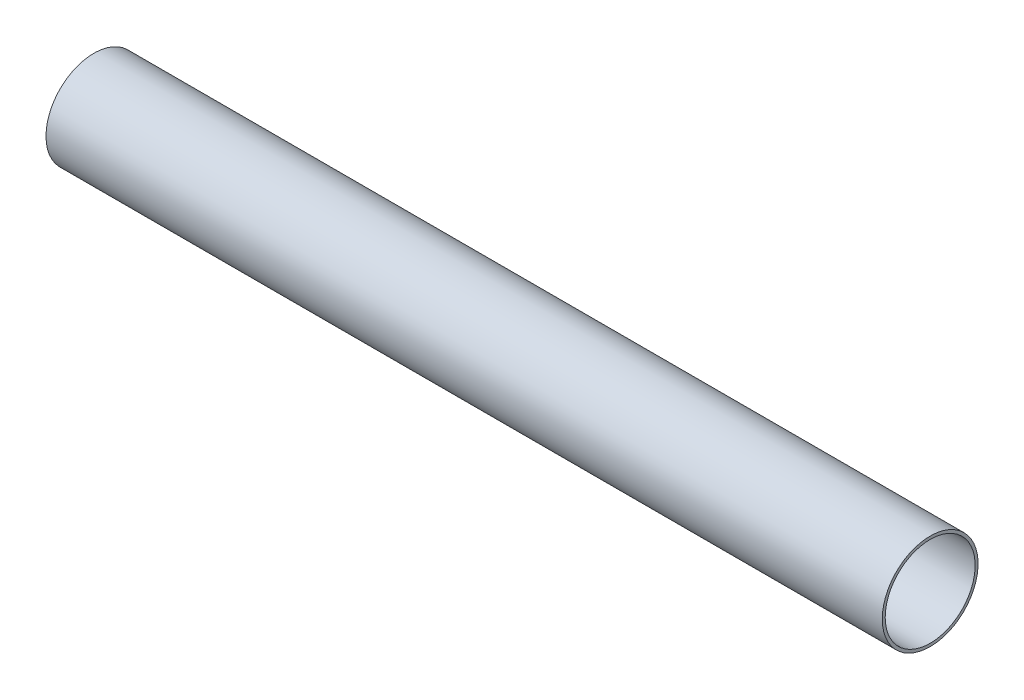
ISO-10303-21;
HEADER;
FILE_DESCRIPTION(('STEP AP214'),'2;1');
FILE_NAME('part.step','',(''),(''),'','','');
FILE_SCHEMA(('AUTOMOTIVE_DESIGN { 1 0 10303 214 1 1 1 1 }'));
ENDSEC;
DATA;
#1=APPLICATION_CONTEXT('core data for automotive mechanical design processes');
#2=APPLICATION_PROTOCOL_DEFINITION('international standard','automotive_design',2000,#1);
#3=PRODUCT_CONTEXT('',#1,'mechanical');
#4=PRODUCT('Part','Part','',(#3));
#5=PRODUCT_RELATED_PRODUCT_CATEGORY('part','',(#4));
#6=PRODUCT_DEFINITION_FORMATION('','',#4);
#7=PRODUCT_DEFINITION_CONTEXT('part definition',#1,'design');
#8=PRODUCT_DEFINITION('design','',#6,#7);
#9=PRODUCT_DEFINITION_SHAPE('','',#8);
#10=(LENGTH_UNIT() NAMED_UNIT(*) SI_UNIT(.MILLI.,.METRE.));
#11=(NAMED_UNIT(*) PLANE_ANGLE_UNIT() SI_UNIT($,.RADIAN.));
#12=(NAMED_UNIT(*) SI_UNIT($,.STERADIAN.) SOLID_ANGLE_UNIT());
#13=UNCERTAINTY_MEASURE_WITH_UNIT(LENGTH_MEASURE(1.E-05),#10,'distance_accuracy_value','');
#14=(GEOMETRIC_REPRESENTATION_CONTEXT(3) GLOBAL_UNCERTAINTY_ASSIGNED_CONTEXT((#13)) GLOBAL_UNIT_ASSIGNED_CONTEXT((#10,
#11,#12)) REPRESENTATION_CONTEXT('',''));
#15=CARTESIAN_POINT('',(0.,0.,0.));
#16=DIRECTION('',(0.,0.,1.));
#17=DIRECTION('',(1.,0.,0.));
#18=AXIS2_PLACEMENT_3D('',#15,#16,#17);
#19=CARTESIAN_POINT('',(152.4,0.,0.));
#20=DIRECTION('',(1.,0.,0.));
#21=DIRECTION('',(0.,0.,-1.));
#22=AXIS2_PLACEMENT_3D('',#19,#20,#21);
#23=PLANE('',#22);
#24=CARTESIAN_POINT('',(152.4,0.,0.));
#25=DIRECTION('',(1.,0.,0.));
#26=DIRECTION('',(0.,0.,-1.));
#27=AXIS2_PLACEMENT_3D('',#24,#25,#26);
#28=CIRCLE('',#27,17.4625);
#29=CARTESIAN_POINT('',(152.4,0.,17.4625));
#30=VERTEX_POINT('',#29);
#31=EDGE_CURVE('E10',#30,#30,#28,.T.);
#32=ORIENTED_EDGE('',*,*,#31,.T.);
#33=EDGE_LOOP('',(#32));
#34=FACE_BOUND('',#33,.T.);
#35=CARTESIAN_POINT('',(152.4,0.,0.));
#36=DIRECTION('',(1.,0.,0.));
#37=DIRECTION('',(0.,0.,-1.));
#38=AXIS2_PLACEMENT_3D('',#35,#36,#37);
#39=CIRCLE('',#38,16.3957);
#40=CARTESIAN_POINT('',(152.4,0.,16.3957));
#41=VERTEX_POINT('',#40);
#42=EDGE_CURVE('E43',#41,#41,#39,.T.);
#43=ORIENTED_EDGE('',*,*,#42,.F.);
#44=EDGE_LOOP('',(#43));
#45=FACE_BOUND('',#44,.T.);
#46=ADVANCED_FACE('F32',(#34,#45),#23,.T.);
#47=CARTESIAN_POINT('',(-152.4,0.,0.));
#48=DIRECTION('',(1.,0.,0.));
#49=DIRECTION('',(0.,0.,-1.));
#50=AXIS2_PLACEMENT_3D('',#47,#48,#49);
#51=PLANE('',#50);
#52=CARTESIAN_POINT('',(-152.4,0.,0.));
#53=DIRECTION('',(1.,0.,0.));
#54=DIRECTION('',(0.,0.,-1.));
#55=AXIS2_PLACEMENT_3D('',#52,#53,#54);
#56=CIRCLE('',#55,17.4625);
#57=CARTESIAN_POINT('',(-152.4,0.,17.4625));
#58=VERTEX_POINT('',#57);
#59=EDGE_CURVE('E36',#58,#58,#56,.T.);
#60=ORIENTED_EDGE('',*,*,#59,.F.);
#61=EDGE_LOOP('',(#60));
#62=FACE_BOUND('',#61,.T.);
#63=CARTESIAN_POINT('',(-152.4,0.,0.));
#64=DIRECTION('',(1.,0.,0.));
#65=DIRECTION('',(0.,0.,-1.));
#66=AXIS2_PLACEMENT_3D('',#63,#64,#65);
#67=CIRCLE('',#66,16.3957);
#68=CARTESIAN_POINT('',(-152.4,0.,16.3957));
#69=VERTEX_POINT('',#68);
#70=EDGE_CURVE('E45',#69,#69,#67,.T.);
#71=ORIENTED_EDGE('',*,*,#70,.T.);
#72=EDGE_LOOP('',(#71));
#73=FACE_BOUND('',#72,.T.);
#74=ADVANCED_FACE('F55',(#62,#73),#51,.F.);
#75=CARTESIAN_POINT('',(152.4,0.,0.));
#76=DIRECTION('',(-1.,0.,0.));
#77=DIRECTION('',(0.,0.,1.));
#78=AXIS2_PLACEMENT_3D('',#75,#76,#77);
#79=CYLINDRICAL_SURFACE('',#78,17.4625);
#80=CARTESIAN_POINT('',(152.4,0.,17.4625));
#81=CARTESIAN_POINT('',(149.225,0.,17.4625));
#82=CARTESIAN_POINT('',(146.05,0.,17.4625));
#83=CARTESIAN_POINT('',(139.7,0.,17.4625));
#84=CARTESIAN_POINT('',(136.525,0.,17.4625));
#85=CARTESIAN_POINT('',(130.175,0.,17.4625));
#86=CARTESIAN_POINT('',(127.,0.,17.4625));
#87=CARTESIAN_POINT('',(120.65,0.,17.4625));
#88=CARTESIAN_POINT('',(117.475,0.,17.4625));
#89=CARTESIAN_POINT('',(111.125,0.,17.4625));
#90=CARTESIAN_POINT('',(107.95,0.,17.4625));
#91=CARTESIAN_POINT('',(101.6,0.,17.4625));
#92=CARTESIAN_POINT('',(98.425,0.,17.4625));
#93=CARTESIAN_POINT('',(92.075,0.,17.4625));
#94=CARTESIAN_POINT('',(88.9,0.,17.4625));
#95=CARTESIAN_POINT('',(82.55,0.,17.4625));
#96=CARTESIAN_POINT('',(79.375,0.,17.4625));
#97=CARTESIAN_POINT('',(73.025,0.,17.4625));
#98=CARTESIAN_POINT('',(69.85,0.,17.4625));
#99=CARTESIAN_POINT('',(63.5,0.,17.4625));
#100=CARTESIAN_POINT('',(60.325,0.,17.4625));
#101=CARTESIAN_POINT('',(53.975,0.,17.4625));
#102=CARTESIAN_POINT('',(50.8,0.,17.4625));
#103=CARTESIAN_POINT('',(44.45,0.,17.4625));
#104=CARTESIAN_POINT('',(41.275,0.,17.4625));
#105=CARTESIAN_POINT('',(34.925,0.,17.4625));
#106=CARTESIAN_POINT('',(31.75,0.,17.4625));
#107=CARTESIAN_POINT('',(25.4,0.,17.4625));
#108=CARTESIAN_POINT('',(22.225,0.,17.4625));
#109=CARTESIAN_POINT('',(15.875,0.,17.4625));
#110=CARTESIAN_POINT('',(12.7,0.,17.4625));
#111=CARTESIAN_POINT('',(6.35,0.,17.4625));
#112=CARTESIAN_POINT('',(3.175,0.,17.4625));
#113=CARTESIAN_POINT('',(-3.175,0.,17.4625));
#114=CARTESIAN_POINT('',(-6.35,0.,17.4625));
#115=CARTESIAN_POINT('',(-12.7,0.,17.4625));
#116=CARTESIAN_POINT('',(-15.875,0.,17.4625));
#117=CARTESIAN_POINT('',(-22.225,0.,17.4625));
#118=CARTESIAN_POINT('',(-25.4,0.,17.4625));
#119=CARTESIAN_POINT('',(-31.75,0.,17.4625));
#120=CARTESIAN_POINT('',(-34.925,0.,17.4625));
#121=CARTESIAN_POINT('',(-41.275,0.,17.4625));
#122=CARTESIAN_POINT('',(-44.45,0.,17.4625));
#123=CARTESIAN_POINT('',(-50.8,0.,17.4625));
#124=CARTESIAN_POINT('',(-53.975,0.,17.4625));
#125=CARTESIAN_POINT('',(-60.325,0.,17.4625));
#126=CARTESIAN_POINT('',(-63.5,0.,17.4625));
#127=CARTESIAN_POINT('',(-69.85,0.,17.4625));
#128=CARTESIAN_POINT('',(-73.025,0.,17.4625));
#129=CARTESIAN_POINT('',(-79.375,0.,17.4625));
#130=CARTESIAN_POINT('',(-82.55,0.,17.4625));
#131=CARTESIAN_POINT('',(-88.9,0.,17.4625));
#132=CARTESIAN_POINT('',(-92.075,0.,17.4625));
#133=CARTESIAN_POINT('',(-98.425,0.,17.4625));
#134=CARTESIAN_POINT('',(-101.6,0.,17.4625));
#135=CARTESIAN_POINT('',(-107.95,0.,17.4625));
#136=CARTESIAN_POINT('',(-111.125,0.,17.4625));
#137=CARTESIAN_POINT('',(-117.475,0.,17.4625));
#138=CARTESIAN_POINT('',(-120.65,0.,17.4625));
#139=CARTESIAN_POINT('',(-127.,0.,17.4625));
#140=CARTESIAN_POINT('',(-130.175,0.,17.4625));
#141=CARTESIAN_POINT('',(-136.525,0.,17.4625));
#142=CARTESIAN_POINT('',(-139.7,0.,17.4625));
#143=CARTESIAN_POINT('',(-146.05,0.,17.4625));
#144=CARTESIAN_POINT('',(-149.225,0.,17.4625));
#145=CARTESIAN_POINT('',(-152.4,0.,17.4625));
#146=B_SPLINE_CURVE_WITH_KNOTS('',3,(#80,#81,#82,#83,#84,#85,#86,#87,#88,#89,#90,#91,#92,#93,
#94,#95,#96,#97,#98,#99,#100,#101,#102,#103,#104,#105,#106,#107,#108,#109,#110,#111,#112,#113,
#114,#115,#116,#117,#118,#119,#120,#121,#122,#123,#124,#125,#126,#127,#128,#129,#130,#131,#132,
#133,#134,#135,#136,#137,#138,#139,#140,#141,#142,#143,#144,#145),.UNSPECIFIED.,.F.,.F.,(4,2,2,
2,2,2,2,2,2,2,2,2,2,2,2,2,2,2,2,2,2,2,2,2,2,2,2,2,2,2,2,2,4),(0.,9.52500000000001,19.05,28.575,
38.1,47.625,57.15,66.675,76.2,85.725,95.25,104.775,114.3,123.825,133.35,142.875,152.4,161.925,
171.45,180.975,190.5,200.025,209.55,219.075,228.6,238.125,247.65,257.175,266.7,276.225,285.75,
295.275,304.8),.UNSPECIFIED.);
#147=EDGE_CURVE('BSEAM34',#30,#58,#146,.T.);
#148=ORIENTED_EDGE('',*,*,#31,.F.);
#149=ORIENTED_EDGE('',*,*,#59,.T.);
#150=ORIENTED_EDGE('',*,*,#147,.T.);
#151=ORIENTED_EDGE('',*,*,#147,.F.);
#152=EDGE_LOOP('',(#148,#150,#149,#151));
#153=FACE_BOUND('',#152,.T.);
#154=ADVANCED_FACE('F34',(#153),#79,.T.);
#155=CARTESIAN_POINT('',(152.4,0.,0.));
#156=DIRECTION('',(-1.,0.,0.));
#157=DIRECTION('',(0.,0.,1.));
#158=AXIS2_PLACEMENT_3D('',#155,#156,#157);
#159=CYLINDRICAL_SURFACE('',#158,16.3957);
#160=CARTESIAN_POINT('',(152.4,0.,16.3957));
#161=CARTESIAN_POINT('',(149.225,0.,16.3957));
#162=CARTESIAN_POINT('',(146.05,0.,16.3957));
#163=CARTESIAN_POINT('',(139.7,0.,16.3957));
#164=CARTESIAN_POINT('',(136.525,0.,16.3957));
#165=CARTESIAN_POINT('',(130.175,0.,16.3957));
#166=CARTESIAN_POINT('',(127.,0.,16.3957));
#167=CARTESIAN_POINT('',(120.65,0.,16.3957));
#168=CARTESIAN_POINT('',(117.475,0.,16.3957));
#169=CARTESIAN_POINT('',(111.125,0.,16.3957));
#170=CARTESIAN_POINT('',(107.95,0.,16.3957));
#171=CARTESIAN_POINT('',(101.6,0.,16.3957));
#172=CARTESIAN_POINT('',(98.425,0.,16.3957));
#173=CARTESIAN_POINT('',(92.075,0.,16.3957));
#174=CARTESIAN_POINT('',(88.9,0.,16.3957));
#175=CARTESIAN_POINT('',(82.55,0.,16.3957));
#176=CARTESIAN_POINT('',(79.375,0.,16.3957));
#177=CARTESIAN_POINT('',(73.025,0.,16.3957));
#178=CARTESIAN_POINT('',(69.85,0.,16.3957));
#179=CARTESIAN_POINT('',(63.5,0.,16.3957));
#180=CARTESIAN_POINT('',(60.325,0.,16.3957));
#181=CARTESIAN_POINT('',(53.975,0.,16.3957));
#182=CARTESIAN_POINT('',(50.8,0.,16.3957));
#183=CARTESIAN_POINT('',(44.45,0.,16.3957));
#184=CARTESIAN_POINT('',(41.275,0.,16.3957));
#185=CARTESIAN_POINT('',(34.925,0.,16.3957));
#186=CARTESIAN_POINT('',(31.75,0.,16.3957));
#187=CARTESIAN_POINT('',(25.4,0.,16.3957));
#188=CARTESIAN_POINT('',(22.225,0.,16.3957));
#189=CARTESIAN_POINT('',(15.875,0.,16.3957));
#190=CARTESIAN_POINT('',(12.7,0.,16.3957));
#191=CARTESIAN_POINT('',(6.35,0.,16.3957));
#192=CARTESIAN_POINT('',(3.175,0.,16.3957));
#193=CARTESIAN_POINT('',(-3.175,0.,16.3957));
#194=CARTESIAN_POINT('',(-6.35,0.,16.3957));
#195=CARTESIAN_POINT('',(-12.7,0.,16.3957));
#196=CARTESIAN_POINT('',(-15.875,0.,16.3957));
#197=CARTESIAN_POINT('',(-22.225,0.,16.3957));
#198=CARTESIAN_POINT('',(-25.4,0.,16.3957));
#199=CARTESIAN_POINT('',(-31.75,0.,16.3957));
#200=CARTESIAN_POINT('',(-34.925,0.,16.3957));
#201=CARTESIAN_POINT('',(-41.275,0.,16.3957));
#202=CARTESIAN_POINT('',(-44.45,0.,16.3957));
#203=CARTESIAN_POINT('',(-50.8,0.,16.3957));
#204=CARTESIAN_POINT('',(-53.975,0.,16.3957));
#205=CARTESIAN_POINT('',(-60.325,0.,16.3957));
#206=CARTESIAN_POINT('',(-63.5,0.,16.3957));
#207=CARTESIAN_POINT('',(-69.85,0.,16.3957));
#208=CARTESIAN_POINT('',(-73.025,0.,16.3957));
#209=CARTESIAN_POINT('',(-79.375,0.,16.3957));
#210=CARTESIAN_POINT('',(-82.55,0.,16.3957));
#211=CARTESIAN_POINT('',(-88.9,0.,16.3957));
#212=CARTESIAN_POINT('',(-92.075,0.,16.3957));
#213=CARTESIAN_POINT('',(-98.425,0.,16.3957));
#214=CARTESIAN_POINT('',(-101.6,0.,16.3957));
#215=CARTESIAN_POINT('',(-107.95,0.,16.3957));
#216=CARTESIAN_POINT('',(-111.125,0.,16.3957));
#217=CARTESIAN_POINT('',(-117.475,0.,16.3957));
#218=CARTESIAN_POINT('',(-120.65,0.,16.3957));
#219=CARTESIAN_POINT('',(-127.,0.,16.3957));
#220=CARTESIAN_POINT('',(-130.175,0.,16.3957));
#221=CARTESIAN_POINT('',(-136.525,0.,16.3957));
#222=CARTESIAN_POINT('',(-139.7,0.,16.3957));
#223=CARTESIAN_POINT('',(-146.05,0.,16.3957));
#224=CARTESIAN_POINT('',(-149.225,0.,16.3957));
#225=CARTESIAN_POINT('',(-152.4,0.,16.3957));
#226=B_SPLINE_CURVE_WITH_KNOTS('',3,(#160,#161,#162,#163,#164,#165,#166,#167,#168,#169,#170,
#171,#172,#173,#174,#175,#176,#177,#178,#179,#180,#181,#182,#183,#184,#185,#186,#187,#188,#189,
#190,#191,#192,#193,#194,#195,#196,#197,#198,#199,#200,#201,#202,#203,#204,#205,#206,#207,#208,
#209,#210,#211,#212,#213,#214,#215,#216,#217,#218,#219,#220,#221,#222,#223,#224,#225),
.UNSPECIFIED.,.F.,.F.,(4,2,2,2,2,2,2,2,2,2,2,2,2,2,2,2,2,2,2,2,2,2,2,2,2,2,2,2,2,2,2,2,4),(0.,
9.52500000000001,19.05,28.575,38.1,47.625,57.15,66.675,76.2,85.725,95.25,104.775,114.3,123.825,
133.35,142.875,152.4,161.925,171.45,180.975,190.5,200.025,209.55,219.075,228.6,238.125,247.65,
257.175,266.7,276.225,285.75,295.275,304.8),.UNSPECIFIED.);
#227=EDGE_CURVE('BSEAM51',#41,#69,#226,.T.);
#228=ORIENTED_EDGE('',*,*,#42,.T.);
#229=ORIENTED_EDGE('',*,*,#70,.F.);
#230=ORIENTED_EDGE('',*,*,#227,.T.);
#231=ORIENTED_EDGE('',*,*,#227,.F.);
#232=EDGE_LOOP('',(#228,#230,#229,#231));
#233=FACE_BOUND('',#232,.T.);
#234=ADVANCED_FACE('F51',(#233),#159,.F.);
#235=CLOSED_SHELL('',(#46,#74,#154,#234));
#236=MANIFOLD_SOLID_BREP('B2',#235);
#237=ADVANCED_BREP_SHAPE_REPRESENTATION('',(#18,#236),#14);
#238=SHAPE_DEFINITION_REPRESENTATION(#9,#237);
ENDSEC;
END-ISO-10303-21;
